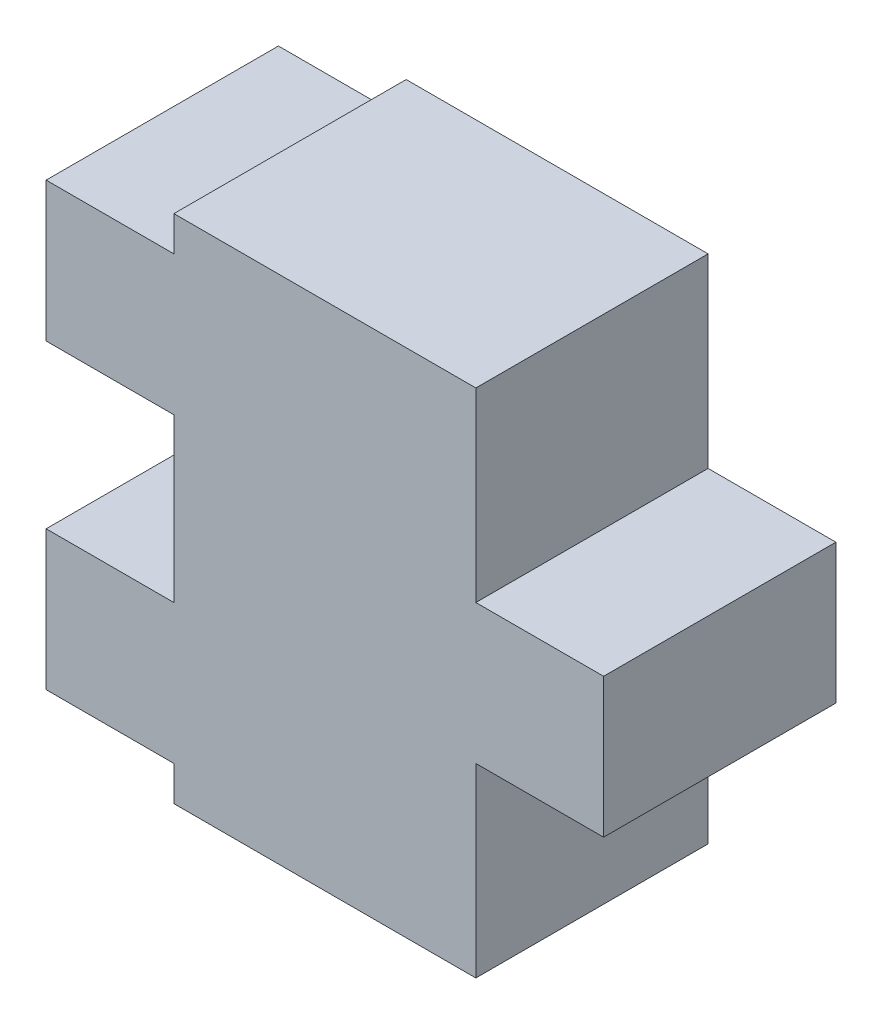
ISO-10303-21;
HEADER;
FILE_DESCRIPTION(('STEP AP214'),'2;1');
FILE_NAME('part.step','',(''),(''),'','','');
FILE_SCHEMA(('AUTOMOTIVE_DESIGN { 1 0 10303 214 1 1 1 1 }'));
ENDSEC;
DATA;
#1=APPLICATION_CONTEXT('core data for automotive mechanical design processes');
#2=APPLICATION_PROTOCOL_DEFINITION('international standard','automotive_design',2000,#1);
#3=PRODUCT_CONTEXT('',#1,'mechanical');
#4=PRODUCT('Part','Part','',(#3));
#5=PRODUCT_RELATED_PRODUCT_CATEGORY('part','',(#4));
#6=PRODUCT_DEFINITION_FORMATION('','',#4);
#7=PRODUCT_DEFINITION_CONTEXT('part definition',#1,'design');
#8=PRODUCT_DEFINITION('design','',#6,#7);
#9=PRODUCT_DEFINITION_SHAPE('','',#8);
#10=(LENGTH_UNIT() NAMED_UNIT(*) SI_UNIT(.MILLI.,.METRE.));
#11=(NAMED_UNIT(*) PLANE_ANGLE_UNIT() SI_UNIT($,.RADIAN.));
#12=(NAMED_UNIT(*) SI_UNIT($,.STERADIAN.) SOLID_ANGLE_UNIT());
#13=UNCERTAINTY_MEASURE_WITH_UNIT(LENGTH_MEASURE(1.E-05),#10,'distance_accuracy_value','');
#14=(GEOMETRIC_REPRESENTATION_CONTEXT(3) GLOBAL_UNCERTAINTY_ASSIGNED_CONTEXT((#13)) GLOBAL_UNIT_ASSIGNED_CONTEXT((#10,
#11,#12)) REPRESENTATION_CONTEXT('',''));
#15=CARTESIAN_POINT('',(0.,0.,0.));
#16=DIRECTION('',(0.,0.,1.));
#17=DIRECTION('',(1.,0.,0.));
#18=AXIS2_PLACEMENT_3D('',#15,#16,#17);
#19=CARTESIAN_POINT('',(0.65,1.1,1.));
#20=DIRECTION('',(0.,-1.,0.));
#21=DIRECTION('',(0.,0.,-1.));
#22=AXIS2_PLACEMENT_3D('',#19,#20,#21);
#23=PLANE('',#22);
#24=DIRECTION('',(-1.,0.,0.));
#25=VECTOR('',#24,1.);
#26=CARTESIAN_POINT('',(0.65,1.1,0.));
#27=LINE('',#26,#25);
#28=CARTESIAN_POINT('',(0.65,1.1,0.));
#29=VERTEX_POINT('',#28);
#30=CARTESIAN_POINT('',(-0.65,1.1,0.));
#31=VERTEX_POINT('',#30);
#32=EDGE_CURVE('E178',#29,#31,#27,.T.);
#33=ORIENTED_EDGE('',*,*,#32,.T.);
#34=DIRECTION('',(0.,0.,-1.));
#35=VECTOR('',#34,1.);
#36=CARTESIAN_POINT('',(-0.65,1.1,1.));
#37=LINE('',#36,#35);
#38=CARTESIAN_POINT('',(-0.65,1.1,1.));
#39=VERTEX_POINT('',#38);
#40=EDGE_CURVE('E11',#39,#31,#37,.T.);
#41=ORIENTED_EDGE('',*,*,#40,.F.);
#42=DIRECTION('',(-1.,0.,0.));
#43=VECTOR('',#42,1.);
#44=CARTESIAN_POINT('',(0.65,1.1,1.));
#45=LINE('',#44,#43);
#46=CARTESIAN_POINT('',(0.65,1.1,1.));
#47=VERTEX_POINT('',#46);
#48=EDGE_CURVE('E208',#47,#39,#45,.T.);
#49=ORIENTED_EDGE('',*,*,#48,.F.);
#50=DIRECTION('',(0.,0.,-1.));
#51=VECTOR('',#50,1.);
#52=CARTESIAN_POINT('',(0.65,1.1,1.));
#53=LINE('',#52,#51);
#54=EDGE_CURVE('E174',#47,#29,#53,.T.);
#55=ORIENTED_EDGE('',*,*,#54,.T.);
#56=EDGE_LOOP('',(#33,#41,#49,#55));
#57=FACE_BOUND('',#56,.T.);
#58=ADVANCED_FACE('F34',(#57),#23,.F.);
#59=CARTESIAN_POINT('',(-0.65,1.1,1.));
#60=DIRECTION('',(1.,0.,0.));
#61=DIRECTION('',(0.,0.,-1.));
#62=AXIS2_PLACEMENT_3D('',#59,#60,#61);
#63=PLANE('',#62);
#64=DIRECTION('',(0.,-1.,0.));
#65=VECTOR('',#64,1.);
#66=CARTESIAN_POINT('',(-0.65,1.1,0.));
#67=LINE('',#66,#65);
#68=CARTESIAN_POINT('',(-0.65,0.95,0.));
#69=VERTEX_POINT('',#68);
#70=EDGE_CURVE('E181',#31,#69,#67,.T.);
#71=ORIENTED_EDGE('',*,*,#70,.T.);
#72=DIRECTION('',(0.,0.,-1.));
#73=VECTOR('',#72,1.);
#74=CARTESIAN_POINT('',(-0.65,0.95,1.));
#75=LINE('',#74,#73);
#76=CARTESIAN_POINT('',(-0.65,0.95,1.));
#77=VERTEX_POINT('',#76);
#78=EDGE_CURVE('E42',#77,#69,#75,.T.);
#79=ORIENTED_EDGE('',*,*,#78,.F.);
#80=DIRECTION('',(0.,-1.,0.));
#81=VECTOR('',#80,1.);
#82=CARTESIAN_POINT('',(-0.65,1.1,1.));
#83=LINE('',#82,#81);
#84=EDGE_CURVE('E117',#39,#77,#83,.T.);
#85=ORIENTED_EDGE('',*,*,#84,.F.);
#86=ORIENTED_EDGE('',*,*,#40,.T.);
#87=EDGE_LOOP('',(#71,#79,#85,#86));
#88=FACE_BOUND('',#87,.T.);
#89=ADVANCED_FACE('F306',(#88),#63,.F.);
#90=CARTESIAN_POINT('',(-0.65,0.95,1.));
#91=DIRECTION('',(0.,-1.,0.));
#92=DIRECTION('',(0.,0.,-1.));
#93=AXIS2_PLACEMENT_3D('',#90,#91,#92);
#94=PLANE('',#93);
#95=DIRECTION('',(-1.,0.,0.));
#96=VECTOR('',#95,1.);
#97=CARTESIAN_POINT('',(-0.65,0.95,0.));
#98=LINE('',#97,#96);
#99=CARTESIAN_POINT('',(-1.2,0.95,0.));
#100=VERTEX_POINT('',#99);
#101=EDGE_CURVE('E183',#69,#100,#98,.T.);
#102=ORIENTED_EDGE('',*,*,#101,.T.);
#103=DIRECTION('',(0.,0.,-1.));
#104=VECTOR('',#103,1.);
#105=CARTESIAN_POINT('',(-1.2,0.95,1.));
#106=LINE('',#105,#104);
#107=CARTESIAN_POINT('',(-1.2,0.95,1.));
#108=VERTEX_POINT('',#107);
#109=EDGE_CURVE('E239',#108,#100,#106,.T.);
#110=ORIENTED_EDGE('',*,*,#109,.F.);
#111=DIRECTION('',(-1.,0.,0.));
#112=VECTOR('',#111,1.);
#113=CARTESIAN_POINT('',(-0.65,0.95,1.));
#114=LINE('',#113,#112);
#115=EDGE_CURVE('E247',#77,#108,#114,.T.);
#116=ORIENTED_EDGE('',*,*,#115,.F.);
#117=ORIENTED_EDGE('',*,*,#78,.T.);
#118=EDGE_LOOP('',(#102,#110,#116,#117));
#119=FACE_BOUND('',#118,.T.);
#120=ADVANCED_FACE('F245',(#119),#94,.F.);
#121=CARTESIAN_POINT('',(-1.2,0.95,1.));
#122=DIRECTION('',(1.,0.,0.));
#123=DIRECTION('',(0.,0.,-1.));
#124=AXIS2_PLACEMENT_3D('',#121,#122,#123);
#125=PLANE('',#124);
#126=DIRECTION('',(0.,-1.,0.));
#127=VECTOR('',#126,1.);
#128=CARTESIAN_POINT('',(-1.2,0.95,0.));
#129=LINE('',#128,#127);
#130=CARTESIAN_POINT('',(-1.2,0.35,0.));
#131=VERTEX_POINT('',#130);
#132=EDGE_CURVE('E185',#100,#131,#129,.T.);
#133=ORIENTED_EDGE('',*,*,#132,.T.);
#134=DIRECTION('',(0.,0.,-1.));
#135=VECTOR('',#134,1.);
#136=CARTESIAN_POINT('',(-1.2,0.35,1.));
#137=LINE('',#136,#135);
#138=CARTESIAN_POINT('',(-1.2,0.35,1.));
#139=VERTEX_POINT('',#138);
#140=EDGE_CURVE('E236',#139,#131,#137,.T.);
#141=ORIENTED_EDGE('',*,*,#140,.F.);
#142=DIRECTION('',(0.,-1.,0.));
#143=VECTOR('',#142,1.);
#144=CARTESIAN_POINT('',(-1.2,0.95,1.));
#145=LINE('',#144,#143);
#146=EDGE_CURVE('E265',#108,#139,#145,.T.);
#147=ORIENTED_EDGE('',*,*,#146,.F.);
#148=ORIENTED_EDGE('',*,*,#109,.T.);
#149=EDGE_LOOP('',(#133,#141,#147,#148));
#150=FACE_BOUND('',#149,.T.);
#151=ADVANCED_FACE('F256',(#150),#125,.F.);
#152=CARTESIAN_POINT('',(-1.2,0.35,1.));
#153=DIRECTION('',(0.,1.,0.));
#154=DIRECTION('',(0.,0.,1.));
#155=AXIS2_PLACEMENT_3D('',#152,#153,#154);
#156=PLANE('',#155);
#157=DIRECTION('',(1.,0.,0.));
#158=VECTOR('',#157,1.);
#159=CARTESIAN_POINT('',(-1.2,0.35,0.));
#160=LINE('',#159,#158);
#161=CARTESIAN_POINT('',(-0.65,0.35,0.));
#162=VERTEX_POINT('',#161);
#163=EDGE_CURVE('E187',#131,#162,#160,.T.);
#164=ORIENTED_EDGE('',*,*,#163,.T.);
#165=DIRECTION('',(0.,0.,-1.));
#166=VECTOR('',#165,1.);
#167=CARTESIAN_POINT('',(-0.65,0.35,1.));
#168=LINE('',#167,#166);
#169=CARTESIAN_POINT('',(-0.65,0.35,1.));
#170=VERTEX_POINT('',#169);
#171=EDGE_CURVE('E233',#170,#162,#168,.T.);
#172=ORIENTED_EDGE('',*,*,#171,.F.);
#173=DIRECTION('',(1.,0.,0.));
#174=VECTOR('',#173,1.);
#175=CARTESIAN_POINT('',(-1.2,0.35,1.));
#176=LINE('',#175,#174);
#177=EDGE_CURVE('E262',#139,#170,#176,.T.);
#178=ORIENTED_EDGE('',*,*,#177,.F.);
#179=ORIENTED_EDGE('',*,*,#140,.T.);
#180=EDGE_LOOP('',(#164,#172,#178,#179));
#181=FACE_BOUND('',#180,.T.);
#182=ADVANCED_FACE('F260',(#181),#156,.F.);
#183=CARTESIAN_POINT('',(-0.65,0.35,1.));
#184=DIRECTION('',(1.,0.,0.));
#185=DIRECTION('',(0.,0.,-1.));
#186=AXIS2_PLACEMENT_3D('',#183,#184,#185);
#187=PLANE('',#186);
#188=DIRECTION('',(0.,-1.,0.));
#189=VECTOR('',#188,1.);
#190=CARTESIAN_POINT('',(-0.65,0.35,0.));
#191=LINE('',#190,#189);
#192=CARTESIAN_POINT('',(-0.65,-0.35,0.));
#193=VERTEX_POINT('',#192);
#194=EDGE_CURVE('E189',#162,#193,#191,.T.);
#195=ORIENTED_EDGE('',*,*,#194,.T.);
#196=DIRECTION('',(0.,0.,-1.));
#197=VECTOR('',#196,1.);
#198=CARTESIAN_POINT('',(-0.65,-0.35,1.));
#199=LINE('',#198,#197);
#200=CARTESIAN_POINT('',(-0.65,-0.35,1.));
#201=VERTEX_POINT('',#200);
#202=EDGE_CURVE('E230',#201,#193,#199,.T.);
#203=ORIENTED_EDGE('',*,*,#202,.F.);
#204=DIRECTION('',(0.,-1.,0.));
#205=VECTOR('',#204,1.);
#206=CARTESIAN_POINT('',(-0.65,0.35,1.));
#207=LINE('',#206,#205);
#208=EDGE_CURVE('E264',#170,#201,#207,.T.);
#209=ORIENTED_EDGE('',*,*,#208,.F.);
#210=ORIENTED_EDGE('',*,*,#171,.T.);
#211=EDGE_LOOP('',(#195,#203,#209,#210));
#212=FACE_BOUND('',#211,.T.);
#213=ADVANCED_FACE('F319',(#212),#187,.F.);
#214=CARTESIAN_POINT('',(-0.65,-0.35,1.));
#215=DIRECTION('',(0.,-1.,0.));
#216=DIRECTION('',(0.,0.,-1.));
#217=AXIS2_PLACEMENT_3D('',#214,#215,#216);
#218=PLANE('',#217);
#219=DIRECTION('',(-1.,0.,0.));
#220=VECTOR('',#219,1.);
#221=CARTESIAN_POINT('',(-0.65,-0.35,0.));
#222=LINE('',#221,#220);
#223=CARTESIAN_POINT('',(-1.2,-0.35,0.));
#224=VERTEX_POINT('',#223);
#225=EDGE_CURVE('E191',#193,#224,#222,.T.);
#226=ORIENTED_EDGE('',*,*,#225,.T.);
#227=DIRECTION('',(0.,0.,-1.));
#228=VECTOR('',#227,1.);
#229=CARTESIAN_POINT('',(-1.2,-0.35,1.));
#230=LINE('',#229,#228);
#231=CARTESIAN_POINT('',(-1.2,-0.35,1.));
#232=VERTEX_POINT('',#231);
#233=EDGE_CURVE('E227',#232,#224,#230,.T.);
#234=ORIENTED_EDGE('',*,*,#233,.F.);
#235=DIRECTION('',(-1.,0.,0.));
#236=VECTOR('',#235,1.);
#237=CARTESIAN_POINT('',(-0.65,-0.35,1.));
#238=LINE('',#237,#236);
#239=EDGE_CURVE('E267',#201,#232,#238,.T.);
#240=ORIENTED_EDGE('',*,*,#239,.F.);
#241=ORIENTED_EDGE('',*,*,#202,.T.);
#242=EDGE_LOOP('',(#226,#234,#240,#241));
#243=FACE_BOUND('',#242,.T.);
#244=ADVANCED_FACE('F322',(#243),#218,.F.);
#245=CARTESIAN_POINT('',(-1.2,-0.35,1.));
#246=DIRECTION('',(1.,0.,0.));
#247=DIRECTION('',(0.,0.,-1.));
#248=AXIS2_PLACEMENT_3D('',#245,#246,#247);
#249=PLANE('',#248);
#250=DIRECTION('',(0.,-1.,0.));
#251=VECTOR('',#250,1.);
#252=CARTESIAN_POINT('',(-1.2,-0.35,0.));
#253=LINE('',#252,#251);
#254=CARTESIAN_POINT('',(-1.2,-0.95,0.));
#255=VERTEX_POINT('',#254);
#256=EDGE_CURVE('E193',#224,#255,#253,.T.);
#257=ORIENTED_EDGE('',*,*,#256,.T.);
#258=DIRECTION('',(0.,0.,-1.));
#259=VECTOR('',#258,1.);
#260=CARTESIAN_POINT('',(-1.2,-0.95,1.));
#261=LINE('',#260,#259);
#262=CARTESIAN_POINT('',(-1.2,-0.95,1.));
#263=VERTEX_POINT('',#262);
#264=EDGE_CURVE('E224',#263,#255,#261,.T.);
#265=ORIENTED_EDGE('',*,*,#264,.F.);
#266=DIRECTION('',(0.,-1.,0.));
#267=VECTOR('',#266,1.);
#268=CARTESIAN_POINT('',(-1.2,-0.35,1.));
#269=LINE('',#268,#267);
#270=EDGE_CURVE('E273',#232,#263,#269,.T.);
#271=ORIENTED_EDGE('',*,*,#270,.F.);
#272=ORIENTED_EDGE('',*,*,#233,.T.);
#273=EDGE_LOOP('',(#257,#265,#271,#272));
#274=FACE_BOUND('',#273,.T.);
#275=ADVANCED_FACE('F326',(#274),#249,.F.);
#276=CARTESIAN_POINT('',(-1.2,-0.95,1.));
#277=DIRECTION('',(0.,1.,0.));
#278=DIRECTION('',(0.,0.,1.));
#279=AXIS2_PLACEMENT_3D('',#276,#277,#278);
#280=PLANE('',#279);
#281=DIRECTION('',(1.,0.,0.));
#282=VECTOR('',#281,1.);
#283=CARTESIAN_POINT('',(-1.2,-0.95,0.));
#284=LINE('',#283,#282);
#285=CARTESIAN_POINT('',(-0.65,-0.95,0.));
#286=VERTEX_POINT('',#285);
#287=EDGE_CURVE('E195',#255,#286,#284,.T.);
#288=ORIENTED_EDGE('',*,*,#287,.T.);
#289=DIRECTION('',(0.,0.,-1.));
#290=VECTOR('',#289,1.);
#291=CARTESIAN_POINT('',(-0.65,-0.95,1.));
#292=LINE('',#291,#290);
#293=CARTESIAN_POINT('',(-0.65,-0.95,1.));
#294=VERTEX_POINT('',#293);
#295=EDGE_CURVE('E221',#294,#286,#292,.T.);
#296=ORIENTED_EDGE('',*,*,#295,.F.);
#297=DIRECTION('',(1.,0.,0.));
#298=VECTOR('',#297,1.);
#299=CARTESIAN_POINT('',(-1.2,-0.95,1.));
#300=LINE('',#299,#298);
#301=EDGE_CURVE('E275',#263,#294,#300,.T.);
#302=ORIENTED_EDGE('',*,*,#301,.F.);
#303=ORIENTED_EDGE('',*,*,#264,.T.);
#304=EDGE_LOOP('',(#288,#296,#302,#303));
#305=FACE_BOUND('',#304,.T.);
#306=ADVANCED_FACE('F330',(#305),#280,.F.);
#307=CARTESIAN_POINT('',(-0.65,-0.95,1.));
#308=DIRECTION('',(1.,0.,0.));
#309=DIRECTION('',(0.,0.,-1.));
#310=AXIS2_PLACEMENT_3D('',#307,#308,#309);
#311=PLANE('',#310);
#312=DIRECTION('',(0.,-1.,0.));
#313=VECTOR('',#312,1.);
#314=CARTESIAN_POINT('',(-0.65,-0.95,0.));
#315=LINE('',#314,#313);
#316=CARTESIAN_POINT('',(-0.65,-1.1,0.));
#317=VERTEX_POINT('',#316);
#318=EDGE_CURVE('E197',#286,#317,#315,.T.);
#319=ORIENTED_EDGE('',*,*,#318,.T.);
#320=DIRECTION('',(0.,0.,-1.));
#321=VECTOR('',#320,1.);
#322=CARTESIAN_POINT('',(-0.65,-1.1,1.));
#323=LINE('',#322,#321);
#324=CARTESIAN_POINT('',(-0.65,-1.1,1.));
#325=VERTEX_POINT('',#324);
#326=EDGE_CURVE('E218',#325,#317,#323,.T.);
#327=ORIENTED_EDGE('',*,*,#326,.F.);
#328=DIRECTION('',(0.,-1.,0.));
#329=VECTOR('',#328,1.);
#330=CARTESIAN_POINT('',(-0.65,-0.95,1.));
#331=LINE('',#330,#329);
#332=EDGE_CURVE('E277',#294,#325,#331,.T.);
#333=ORIENTED_EDGE('',*,*,#332,.F.);
#334=ORIENTED_EDGE('',*,*,#295,.T.);
#335=EDGE_LOOP('',(#319,#327,#333,#334));
#336=FACE_BOUND('',#335,.T.);
#337=ADVANCED_FACE('F334',(#336),#311,.F.);
#338=CARTESIAN_POINT('',(-0.65,-1.1,1.));
#339=DIRECTION('',(0.,1.,0.));
#340=DIRECTION('',(0.,0.,1.));
#341=AXIS2_PLACEMENT_3D('',#338,#339,#340);
#342=PLANE('',#341);
#343=DIRECTION('',(1.,0.,0.));
#344=VECTOR('',#343,1.);
#345=CARTESIAN_POINT('',(-0.65,-1.1,0.));
#346=LINE('',#345,#344);
#347=CARTESIAN_POINT('',(0.65,-1.1,0.));
#348=VERTEX_POINT('',#347);
#349=EDGE_CURVE('E199',#317,#348,#346,.T.);
#350=ORIENTED_EDGE('',*,*,#349,.T.);
#351=DIRECTION('',(0.,0.,-1.));
#352=VECTOR('',#351,1.);
#353=CARTESIAN_POINT('',(0.65,-1.1,1.));
#354=LINE('',#353,#352);
#355=CARTESIAN_POINT('',(0.65,-1.1,1.));
#356=VERTEX_POINT('',#355);
#357=EDGE_CURVE('E215',#356,#348,#354,.T.);
#358=ORIENTED_EDGE('',*,*,#357,.F.);
#359=DIRECTION('',(1.,0.,0.));
#360=VECTOR('',#359,1.);
#361=CARTESIAN_POINT('',(-0.65,-1.1,1.));
#362=LINE('',#361,#360);
#363=EDGE_CURVE('E279',#325,#356,#362,.T.);
#364=ORIENTED_EDGE('',*,*,#363,.F.);
#365=ORIENTED_EDGE('',*,*,#326,.T.);
#366=EDGE_LOOP('',(#350,#358,#364,#365));
#367=FACE_BOUND('',#366,.T.);
#368=ADVANCED_FACE('F338',(#367),#342,.F.);
#369=CARTESIAN_POINT('',(0.65,-1.1,1.));
#370=DIRECTION('',(-1.,0.,0.));
#371=DIRECTION('',(0.,0.,1.));
#372=AXIS2_PLACEMENT_3D('',#369,#370,#371);
#373=PLANE('',#372);
#374=DIRECTION('',(0.,1.,0.));
#375=VECTOR('',#374,1.);
#376=CARTESIAN_POINT('',(0.65,-1.1,0.));
#377=LINE('',#376,#375);
#378=CARTESIAN_POINT('',(0.65,-0.3,0.));
#379=VERTEX_POINT('',#378);
#380=EDGE_CURVE('E201',#348,#379,#377,.T.);
#381=ORIENTED_EDGE('',*,*,#380,.T.);
#382=DIRECTION('',(0.,0.,-1.));
#383=VECTOR('',#382,1.);
#384=CARTESIAN_POINT('',(0.65,-0.3,1.));
#385=LINE('',#384,#383);
#386=CARTESIAN_POINT('',(0.65,-0.3,1.));
#387=VERTEX_POINT('',#386);
#388=EDGE_CURVE('E212',#387,#379,#385,.T.);
#389=ORIENTED_EDGE('',*,*,#388,.F.);
#390=DIRECTION('',(0.,1.,0.));
#391=VECTOR('',#390,1.);
#392=CARTESIAN_POINT('',(0.65,-1.1,1.));
#393=LINE('',#392,#391);
#394=EDGE_CURVE('E281',#356,#387,#393,.T.);
#395=ORIENTED_EDGE('',*,*,#394,.F.);
#396=ORIENTED_EDGE('',*,*,#357,.T.);
#397=EDGE_LOOP('',(#381,#389,#395,#396));
#398=FACE_BOUND('',#397,.T.);
#399=ADVANCED_FACE('F287',(#398),#373,.F.);
#400=CARTESIAN_POINT('',(0.65,-0.3,1.));
#401=DIRECTION('',(0.,1.,0.));
#402=DIRECTION('',(0.,0.,1.));
#403=AXIS2_PLACEMENT_3D('',#400,#401,#402);
#404=PLANE('',#403);
#405=DIRECTION('',(1.,0.,0.));
#406=VECTOR('',#405,1.);
#407=CARTESIAN_POINT('',(0.65,-0.3,0.));
#408=LINE('',#407,#406);
#409=CARTESIAN_POINT('',(1.2,-0.3,0.));
#410=VERTEX_POINT('',#409);
#411=EDGE_CURVE('E203',#379,#410,#408,.T.);
#412=ORIENTED_EDGE('',*,*,#411,.T.);
#413=DIRECTION('',(0.,0.,-1.));
#414=VECTOR('',#413,1.);
#415=CARTESIAN_POINT('',(1.2,-0.3,1.));
#416=LINE('',#415,#414);
#417=CARTESIAN_POINT('',(1.2,-0.3,1.));
#418=VERTEX_POINT('',#417);
#419=EDGE_CURVE('E169',#418,#410,#416,.T.);
#420=ORIENTED_EDGE('',*,*,#419,.F.);
#421=DIRECTION('',(1.,0.,0.));
#422=VECTOR('',#421,1.);
#423=CARTESIAN_POINT('',(0.65,-0.3,1.));
#424=LINE('',#423,#422);
#425=EDGE_CURVE('E160',#387,#418,#424,.T.);
#426=ORIENTED_EDGE('',*,*,#425,.F.);
#427=ORIENTED_EDGE('',*,*,#388,.T.);
#428=EDGE_LOOP('',(#412,#420,#426,#427));
#429=FACE_BOUND('',#428,.T.);
#430=ADVANCED_FACE('F291',(#429),#404,.F.);
#431=CARTESIAN_POINT('',(1.2,-0.3,1.));
#432=DIRECTION('',(-1.,0.,0.));
#433=DIRECTION('',(0.,0.,1.));
#434=AXIS2_PLACEMENT_3D('',#431,#432,#433);
#435=PLANE('',#434);
#436=DIRECTION('',(0.,1.,0.));
#437=VECTOR('',#436,1.);
#438=CARTESIAN_POINT('',(1.2,-0.3,0.));
#439=LINE('',#438,#437);
#440=CARTESIAN_POINT('',(1.2,0.3,0.));
#441=VERTEX_POINT('',#440);
#442=EDGE_CURVE('E168',#410,#441,#439,.T.);
#443=ORIENTED_EDGE('',*,*,#442,.T.);
#444=DIRECTION('',(0.,0.,-1.));
#445=VECTOR('',#444,1.);
#446=CARTESIAN_POINT('',(1.2,0.3,1.));
#447=LINE('',#446,#445);
#448=CARTESIAN_POINT('',(1.2,0.3,1.));
#449=VERTEX_POINT('',#448);
#450=EDGE_CURVE('E165',#449,#441,#447,.T.);
#451=ORIENTED_EDGE('',*,*,#450,.F.);
#452=DIRECTION('',(0.,1.,0.));
#453=VECTOR('',#452,1.);
#454=CARTESIAN_POINT('',(1.2,-0.3,1.));
#455=LINE('',#454,#453);
#456=EDGE_CURVE('E154',#418,#449,#455,.T.);
#457=ORIENTED_EDGE('',*,*,#456,.F.);
#458=ORIENTED_EDGE('',*,*,#419,.T.);
#459=EDGE_LOOP('',(#443,#451,#457,#458));
#460=FACE_BOUND('',#459,.T.);
#461=ADVANCED_FACE('F166',(#460),#435,.F.);
#462=CARTESIAN_POINT('',(1.2,0.3,1.));
#463=DIRECTION('',(0.,-1.,0.));
#464=DIRECTION('',(0.,0.,-1.));
#465=AXIS2_PLACEMENT_3D('',#462,#463,#464);
#466=PLANE('',#465);
#467=DIRECTION('',(-1.,0.,0.));
#468=VECTOR('',#467,1.);
#469=CARTESIAN_POINT('',(1.2,0.3,0.));
#470=LINE('',#469,#468);
#471=CARTESIAN_POINT('',(0.65,0.3,0.));
#472=VERTEX_POINT('',#471);
#473=EDGE_CURVE('E103',#441,#472,#470,.T.);
#474=ORIENTED_EDGE('',*,*,#473,.T.);
#475=DIRECTION('',(0.,0.,-1.));
#476=VECTOR('',#475,1.);
#477=CARTESIAN_POINT('',(0.65,0.3,1.));
#478=LINE('',#477,#476);
#479=CARTESIAN_POINT('',(0.65,0.3,1.));
#480=VERTEX_POINT('',#479);
#481=EDGE_CURVE('E170',#480,#472,#478,.T.);
#482=ORIENTED_EDGE('',*,*,#481,.F.);
#483=DIRECTION('',(-1.,0.,0.));
#484=VECTOR('',#483,1.);
#485=CARTESIAN_POINT('',(1.2,0.3,1.));
#486=LINE('',#485,#484);
#487=EDGE_CURVE('E158',#449,#480,#486,.T.);
#488=ORIENTED_EDGE('',*,*,#487,.F.);
#489=ORIENTED_EDGE('',*,*,#450,.T.);
#490=EDGE_LOOP('',(#474,#482,#488,#489));
#491=FACE_BOUND('',#490,.T.);
#492=ADVANCED_FACE('F172',(#491),#466,.F.);
#493=CARTESIAN_POINT('',(0.65,0.3,1.));
#494=DIRECTION('',(-1.,0.,0.));
#495=DIRECTION('',(0.,0.,1.));
#496=AXIS2_PLACEMENT_3D('',#493,#494,#495);
#497=PLANE('',#496);
#498=DIRECTION('',(0.,1.,0.));
#499=VECTOR('',#498,1.);
#500=CARTESIAN_POINT('',(0.65,0.3,0.));
#501=LINE('',#500,#499);
#502=EDGE_CURVE('E109',#472,#29,#501,.T.);
#503=ORIENTED_EDGE('',*,*,#502,.T.);
#504=ORIENTED_EDGE('',*,*,#54,.F.);
#505=DIRECTION('',(0.,1.,0.));
#506=VECTOR('',#505,1.);
#507=CARTESIAN_POINT('',(0.65,0.3,1.));
#508=LINE('',#507,#506);
#509=EDGE_CURVE('E50',#480,#47,#508,.T.);
#510=ORIENTED_EDGE('',*,*,#509,.F.);
#511=ORIENTED_EDGE('',*,*,#481,.T.);
#512=EDGE_LOOP('',(#503,#504,#510,#511));
#513=FACE_BOUND('',#512,.T.);
#514=ADVANCED_FACE('F295',(#513),#497,.F.);
#515=CARTESIAN_POINT('',(0.,0.,1.));
#516=DIRECTION('',(0.,0.,1.));
#517=DIRECTION('',(1.,0.,0.));
#518=AXIS2_PLACEMENT_3D('',#515,#516,#517);
#519=PLANE('',#518);
#520=ORIENTED_EDGE('',*,*,#48,.T.);
#521=ORIENTED_EDGE('',*,*,#84,.T.);
#522=ORIENTED_EDGE('',*,*,#115,.T.);
#523=ORIENTED_EDGE('',*,*,#146,.T.);
#524=ORIENTED_EDGE('',*,*,#177,.T.);
#525=ORIENTED_EDGE('',*,*,#208,.T.);
#526=ORIENTED_EDGE('',*,*,#239,.T.);
#527=ORIENTED_EDGE('',*,*,#270,.T.);
#528=ORIENTED_EDGE('',*,*,#301,.T.);
#529=ORIENTED_EDGE('',*,*,#332,.T.);
#530=ORIENTED_EDGE('',*,*,#363,.T.);
#531=ORIENTED_EDGE('',*,*,#394,.T.);
#532=ORIENTED_EDGE('',*,*,#425,.T.);
#533=ORIENTED_EDGE('',*,*,#456,.T.);
#534=ORIENTED_EDGE('',*,*,#487,.T.);
#535=ORIENTED_EDGE('',*,*,#509,.T.);
#536=EDGE_LOOP('',(#520,#521,#522,#523,#524,#525,#526,#527,#528,#529,#530,#531,#532,#533,#534,#535));
#537=FACE_BOUND('',#536,.T.);
#538=ADVANCED_FACE('F156',(#537),#519,.T.);
#539=CARTESIAN_POINT('',(0.,0.,0.));
#540=DIRECTION('',(0.,0.,1.));
#541=DIRECTION('',(1.,0.,0.));
#542=AXIS2_PLACEMENT_3D('',#539,#540,#541);
#543=PLANE('',#542);
#544=ORIENTED_EDGE('',*,*,#32,.F.);
#545=ORIENTED_EDGE('',*,*,#502,.F.);
#546=ORIENTED_EDGE('',*,*,#473,.F.);
#547=ORIENTED_EDGE('',*,*,#442,.F.);
#548=ORIENTED_EDGE('',*,*,#411,.F.);
#549=ORIENTED_EDGE('',*,*,#380,.F.);
#550=ORIENTED_EDGE('',*,*,#349,.F.);
#551=ORIENTED_EDGE('',*,*,#318,.F.);
#552=ORIENTED_EDGE('',*,*,#287,.F.);
#553=ORIENTED_EDGE('',*,*,#256,.F.);
#554=ORIENTED_EDGE('',*,*,#225,.F.);
#555=ORIENTED_EDGE('',*,*,#194,.F.);
#556=ORIENTED_EDGE('',*,*,#163,.F.);
#557=ORIENTED_EDGE('',*,*,#132,.F.);
#558=ORIENTED_EDGE('',*,*,#101,.F.);
#559=ORIENTED_EDGE('',*,*,#70,.F.);
#560=EDGE_LOOP('',(#544,#545,#546,#547,#548,#549,#550,#551,#552,#553,#554,#555,#556,#557,#558,#559));
#561=FACE_BOUND('',#560,.T.);
#562=ADVANCED_FACE('F251',(#561),#543,.F.);
#563=CLOSED_SHELL('',(#58,#89,#120,#151,#182,#213,#244,#275,#306,#337,#368,#399,#430,#461,#492,
#514,#538,#562));
#564=MANIFOLD_SOLID_BREP('B2',#563);
#565=ADVANCED_BREP_SHAPE_REPRESENTATION('',(#18,#564),#14);
#566=SHAPE_DEFINITION_REPRESENTATION(#9,#565);
ENDSEC;
END-ISO-10303-21;
